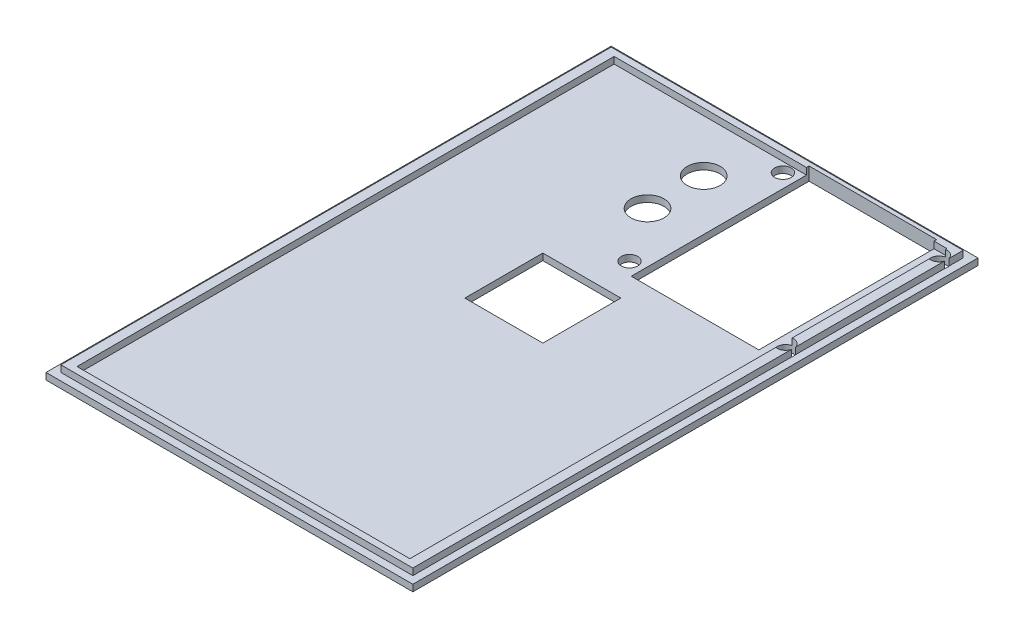
ISO-10303-21;
HEADER;
FILE_DESCRIPTION(('STEP AP214'),'2;1');
FILE_NAME('part.step','',(''),(''),'','','');
FILE_SCHEMA(('AUTOMOTIVE_DESIGN { 1 0 10303 214 1 1 1 1 }'));
ENDSEC;
DATA;
#1=APPLICATION_CONTEXT('core data for automotive mechanical design processes');
#2=APPLICATION_PROTOCOL_DEFINITION('international standard','automotive_design',2000,#1);
#3=PRODUCT_CONTEXT('',#1,'mechanical');
#4=PRODUCT('Part','Part','',(#3));
#5=PRODUCT_RELATED_PRODUCT_CATEGORY('part','',(#4));
#6=PRODUCT_DEFINITION_FORMATION('','',#4);
#7=PRODUCT_DEFINITION_CONTEXT('part definition',#1,'design');
#8=PRODUCT_DEFINITION('design','',#6,#7);
#9=PRODUCT_DEFINITION_SHAPE('','',#8);
#10=(LENGTH_UNIT() NAMED_UNIT(*) SI_UNIT(.MILLI.,.METRE.));
#11=(NAMED_UNIT(*) PLANE_ANGLE_UNIT() SI_UNIT($,.RADIAN.));
#12=(NAMED_UNIT(*) SI_UNIT($,.STERADIAN.) SOLID_ANGLE_UNIT());
#13=UNCERTAINTY_MEASURE_WITH_UNIT(LENGTH_MEASURE(1.E-05),#10,'distance_accuracy_value','');
#14=(GEOMETRIC_REPRESENTATION_CONTEXT(3) GLOBAL_UNCERTAINTY_ASSIGNED_CONTEXT((#13)) GLOBAL_UNIT_ASSIGNED_CONTEXT((#10,
#11,#12)) REPRESENTATION_CONTEXT('',''));
#15=CARTESIAN_POINT('',(0.,0.,0.));
#16=DIRECTION('',(0.,0.,1.));
#17=DIRECTION('',(1.,0.,0.));
#18=AXIS2_PLACEMENT_3D('',#15,#16,#17);
#19=CARTESIAN_POINT('',(0.,2.,0.));
#20=DIRECTION('',(0.,-1.,0.));
#21=DIRECTION('',(0.,0.,-1.));
#22=AXIS2_PLACEMENT_3D('',#19,#20,#21);
#23=PLANE('',#22);
#24=DIRECTION('',(0.,0.,-1.));
#25=VECTOR('',#24,1.);
#26=CARTESIAN_POINT('',(26.625,2.,41.625));
#27=LINE('',#26,#25);
#28=CARTESIAN_POINT('',(26.625,2.,41.625));
#29=VERTEX_POINT('',#28);
#30=CARTESIAN_POINT('',(26.625,2.,-15.638917400209));
#31=VERTEX_POINT('',#30);
#32=EDGE_CURVE('E440',#29,#31,#27,.T.);
#33=ORIENTED_EDGE('',*,*,#32,.T.);
#34=CARTESIAN_POINT('',(25.4190043572082,2.,-15.9631423339737));
#35=DIRECTION('',(0.,-1.,0.));
#36=DIRECTION('',(0.,0.,-1.));
#37=AXIS2_PLACEMENT_3D('',#34,#35,#36);
#38=CIRCLE('',#37,1.24881836073447);
#39=CARTESIAN_POINT('',(25.1779275998991,2.,-14.7378140941975));
#40=VERTEX_POINT('',#39);
#41=EDGE_CURVE('E375',#31,#40,#38,.T.);
#42=ORIENTED_EDGE('',*,*,#41,.T.);
#43=DIRECTION('',(0.,0.,-1.));
#44=VECTOR('',#43,1.);
#45=CARTESIAN_POINT('',(25.1779275998991,2.,40.6300599660008));
#46=LINE('',#45,#44);
#47=CARTESIAN_POINT('',(25.1779275998991,2.,40.6300599660008));
#48=VERTEX_POINT('',#47);
#49=EDGE_CURVE('E389',#48,#40,#46,.T.);
#50=ORIENTED_EDGE('',*,*,#49,.F.);
#51=DIRECTION('',(1.,0.,0.));
#52=VECTOR('',#51,1.);
#53=CARTESIAN_POINT('',(-25.1779275998991,2.,40.6300599660008));
#54=LINE('',#53,#52);
#55=CARTESIAN_POINT('',(-25.1779275998991,2.,40.6300599660008));
#56=VERTEX_POINT('',#55);
#57=EDGE_CURVE('E404',#56,#48,#54,.T.);
#58=ORIENTED_EDGE('',*,*,#57,.F.);
#59=DIRECTION('',(0.,0.,1.));
#60=VECTOR('',#59,1.);
#61=CARTESIAN_POINT('',(-25.1779275998991,2.,40.6300599660008));
#62=LINE('',#61,#60);
#63=CARTESIAN_POINT('',(-25.1779275998991,2.,-40.6300599660008));
#64=VERTEX_POINT('',#63);
#65=EDGE_CURVE('E400',#64,#56,#62,.T.);
#66=ORIENTED_EDGE('',*,*,#65,.F.);
#67=DIRECTION('',(-1.,0.,0.));
#68=VECTOR('',#67,1.);
#69=CARTESIAN_POINT('',(-25.1779275998991,2.,-40.6300599660008));
#70=LINE('',#69,#68);
#71=CARTESIAN_POINT('',(3.91900436854623,2.,-40.6300599660008));
#72=VERTEX_POINT('',#71);
#73=EDGE_CURVE('E393',#72,#64,#70,.T.);
#74=ORIENTED_EDGE('',*,*,#73,.F.);
#75=DIRECTION('',(0.,0.,-1.));
#76=VECTOR('',#75,1.);
#77=CARTESIAN_POINT('',(3.91900436854623,2.,0.));
#78=LINE('',#77,#76);
#79=CARTESIAN_POINT('',(3.91900436854623,2.,-41.0246657109832));
#80=VERTEX_POINT('',#79);
#81=EDGE_CURVE('E352',#72,#80,#78,.T.);
#82=ORIENTED_EDGE('',*,*,#81,.T.);
#83=DIRECTION('',(1.,0.,0.));
#84=VECTOR('',#83,1.);
#85=CARTESIAN_POINT('',(0.,2.,-41.0246657109832));
#86=LINE('',#85,#84);
#87=CARTESIAN_POINT('',(23.2190043685462,2.,-41.0246657109832));
#88=VERTEX_POINT('',#87);
#89=EDGE_CURVE('E11',#80,#88,#86,.T.);
#90=ORIENTED_EDGE('',*,*,#89,.T.);
#91=DIRECTION('',(0.,0.,1.));
#92=VECTOR('',#91,1.);
#93=CARTESIAN_POINT('',(23.2190043685462,2.,0.));
#94=LINE('',#93,#92);
#95=CARTESIAN_POINT('',(23.2190043685462,2.,-40.6300599660008));
#96=VERTEX_POINT('',#95);
#97=EDGE_CURVE('E360',#88,#96,#94,.T.);
#98=ORIENTED_EDGE('',*,*,#97,.T.);
#99=CARTESIAN_POINT('',(25.1779275998991,2.,-40.6300599660008));
#100=VERTEX_POINT('',#99);
#101=EDGE_CURVE('E396',#100,#96,#70,.T.);
#102=ORIENTED_EDGE('',*,*,#101,.F.);
#103=CARTESIAN_POINT('',(25.1779275998991,2.,-40.3910111293174));
#104=VERTEX_POINT('',#103);
#105=EDGE_CURVE('E395',#104,#100,#46,.T.);
#106=ORIENTED_EDGE('',*,*,#105,.F.);
#107=CARTESIAN_POINT('',(25.4190043572082,2.,-39.1624107865857));
#108=DIRECTION('',(0.,-1.,0.));
#109=DIRECTION('',(0.,0.,-1.));
#110=AXIS2_PLACEMENT_3D('',#107,#108,#109);
#111=CIRCLE('',#110,1.25202907517172);
#112=CARTESIAN_POINT('',(26.625,2.,-39.4987905045273));
#113=VERTEX_POINT('',#112);
#114=EDGE_CURVE('E331',#104,#113,#111,.T.);
#115=ORIENTED_EDGE('',*,*,#114,.T.);
#116=CARTESIAN_POINT('',(26.625,2.,-41.625));
#117=VERTEX_POINT('',#116);
#118=EDGE_CURVE('E446',#113,#117,#27,.T.);
#119=ORIENTED_EDGE('',*,*,#118,.T.);
#120=DIRECTION('',(-1.,0.,0.));
#121=VECTOR('',#120,1.);
#122=CARTESIAN_POINT('',(-26.625,2.,-41.625));
#123=LINE('',#122,#121);
#124=CARTESIAN_POINT('',(-26.625,2.,-41.625));
#125=VERTEX_POINT('',#124);
#126=EDGE_CURVE('E444',#117,#125,#123,.T.);
#127=ORIENTED_EDGE('',*,*,#126,.T.);
#128=DIRECTION('',(0.,0.,1.));
#129=VECTOR('',#128,1.);
#130=CARTESIAN_POINT('',(-26.625,2.,41.625));
#131=LINE('',#130,#129);
#132=CARTESIAN_POINT('',(-26.625,2.,41.625));
#133=VERTEX_POINT('',#132);
#134=EDGE_CURVE('E449',#125,#133,#131,.T.);
#135=ORIENTED_EDGE('',*,*,#134,.T.);
#136=DIRECTION('',(1.,0.,0.));
#137=VECTOR('',#136,1.);
#138=CARTESIAN_POINT('',(-26.625,2.,41.625));
#139=LINE('',#138,#137);
#140=EDGE_CURVE('E452',#133,#29,#139,.T.);
#141=ORIENTED_EDGE('',*,*,#140,.T.);
#142=EDGE_LOOP('',(#33,#42,#50,#58,#66,#74,#82,#90,#98,#102,#106,#115,#119,#127,#135,#141));
#143=FACE_BOUND('',#142,.T.);
#144=ADVANCED_FACE('F39',(#143),#23,.F.);
#145=CARTESIAN_POINT('',(26.625,2.,41.625));
#146=DIRECTION('',(-1.,0.,0.));
#147=DIRECTION('',(0.,0.,1.));
#148=AXIS2_PLACEMENT_3D('',#145,#146,#147);
#149=PLANE('',#148);
#150=CARTESIAN_POINT('',(26.625,2.,-16.2873672677383));
#151=VERTEX_POINT('',#150);
#152=CARTESIAN_POINT('',(26.625,2.,-38.826031068644));
#153=VERTEX_POINT('',#152);
#154=EDGE_CURVE('E445',#151,#153,#27,.T.);
#155=ORIENTED_EDGE('',*,*,#154,.F.);
#156=DIRECTION('',(0.,-1.,0.));
#157=VECTOR('',#156,1.);
#158=CARTESIAN_POINT('',(26.625,3.,-16.2873672677383));
#159=LINE('',#158,#157);
#160=CARTESIAN_POINT('',(26.625,1.,-16.2873672677383));
#161=VERTEX_POINT('',#160);
#162=EDGE_CURVE('E380',#151,#161,#159,.T.);
#163=ORIENTED_EDGE('',*,*,#162,.T.);
#164=DIRECTION('',(0.,0.,-1.));
#165=VECTOR('',#164,1.);
#166=CARTESIAN_POINT('',(26.625,1.,41.625));
#167=LINE('',#166,#165);
#168=CARTESIAN_POINT('',(26.625,1.,-38.826031068644));
#169=VERTEX_POINT('',#168);
#170=EDGE_CURVE('E461',#161,#169,#167,.T.);
#171=ORIENTED_EDGE('',*,*,#170,.T.);
#172=DIRECTION('',(0.,-1.,0.));
#173=VECTOR('',#172,1.);
#174=CARTESIAN_POINT('',(26.625,3.,-38.826031068644));
#175=LINE('',#174,#173);
#176=EDGE_CURVE('E336',#169,#153,#175,.F.);
#177=ORIENTED_EDGE('',*,*,#176,.T.);
#178=EDGE_LOOP('',(#155,#163,#171,#177));
#179=FACE_BOUND('',#178,.T.);
#180=ADVANCED_FACE('F635',(#179),#149,.F.);
#181=ORIENTED_EDGE('',*,*,#118,.F.);
#182=DIRECTION('',(0.,-1.,0.));
#183=VECTOR('',#182,1.);
#184=CARTESIAN_POINT('',(26.625,3.,-39.4987905045273));
#185=LINE('',#184,#183);
#186=CARTESIAN_POINT('',(26.625,1.,-39.4987905045273));
#187=VERTEX_POINT('',#186);
#188=EDGE_CURVE('E340',#113,#187,#185,.T.);
#189=ORIENTED_EDGE('',*,*,#188,.T.);
#190=CARTESIAN_POINT('',(26.625,1.,-41.625));
#191=VERTEX_POINT('',#190);
#192=EDGE_CURVE('E439',#187,#191,#167,.T.);
#193=ORIENTED_EDGE('',*,*,#192,.T.);
#194=DIRECTION('',(0.,-1.,0.));
#195=VECTOR('',#194,1.);
#196=CARTESIAN_POINT('',(26.625,2.,-41.625));
#197=LINE('',#196,#195);
#198=EDGE_CURVE('E484',#117,#191,#197,.T.);
#199=ORIENTED_EDGE('',*,*,#198,.F.);
#200=EDGE_LOOP('',(#181,#189,#193,#199));
#201=FACE_BOUND('',#200,.T.);
#202=ADVANCED_FACE('F639',(#201),#149,.F.);
#203=CARTESIAN_POINT('',(25.1779275998991,2.,40.6300599660008));
#204=DIRECTION('',(-1.,0.,0.));
#205=DIRECTION('',(0.,0.,1.));
#206=AXIS2_PLACEMENT_3D('',#203,#204,#205);
#207=PLANE('',#206);
#208=DIRECTION('',(0.,-1.,0.));
#209=VECTOR('',#208,1.);
#210=CARTESIAN_POINT('',(25.1779275998991,3.,-17.1884705737498));
#211=LINE('',#210,#209);
#212=CARTESIAN_POINT('',(25.1779275998991,2.,-17.1884705737498));
#213=VERTEX_POINT('',#212);
#214=CARTESIAN_POINT('',(25.1779275998991,1.,-17.1884705737498));
#215=VERTEX_POINT('',#214);
#216=EDGE_CURVE('E368',#213,#215,#211,.T.);
#217=ORIENTED_EDGE('',*,*,#216,.F.);
#218=CARTESIAN_POINT('',(25.1779275998991,2.,-37.9338104438539));
#219=VERTEX_POINT('',#218);
#220=EDGE_CURVE('E394',#213,#219,#46,.T.);
#221=ORIENTED_EDGE('',*,*,#220,.T.);
#222=DIRECTION('',(0.,-1.,0.));
#223=VECTOR('',#222,1.);
#224=CARTESIAN_POINT('',(25.1779275998991,3.,-37.9338104438539));
#225=LINE('',#224,#223);
#226=CARTESIAN_POINT('',(25.1779275998991,1.,-37.9338104438539));
#227=VERTEX_POINT('',#226);
#228=EDGE_CURVE('E325',#227,#219,#225,.F.);
#229=ORIENTED_EDGE('',*,*,#228,.F.);
#230=DIRECTION('',(0.,0.,-1.));
#231=VECTOR('',#230,1.);
#232=CARTESIAN_POINT('',(25.1779275998991,1.,40.6300599660008));
#233=LINE('',#232,#231);
#234=EDGE_CURVE('E413',#215,#227,#233,.T.);
#235=ORIENTED_EDGE('',*,*,#234,.F.);
#236=EDGE_LOOP('',(#217,#221,#229,#235));
#237=FACE_BOUND('',#236,.T.);
#238=ADVANCED_FACE('F583',(#237),#207,.T.);
#239=DIRECTION('',(0.,-1.,0.));
#240=VECTOR('',#239,1.);
#241=CARTESIAN_POINT('',(25.1779275998991,3.,-40.3910111293174));
#242=LINE('',#241,#240);
#243=CARTESIAN_POINT('',(25.1779275998991,1.,-40.3910111293174));
#244=VERTEX_POINT('',#243);
#245=EDGE_CURVE('E328',#104,#244,#242,.T.);
#246=ORIENTED_EDGE('',*,*,#245,.F.);
#247=ORIENTED_EDGE('',*,*,#105,.T.);
#248=DIRECTION('',(0.,-1.,0.));
#249=VECTOR('',#248,1.);
#250=CARTESIAN_POINT('',(25.1779275998991,2.,-40.6300599660008));
#251=LINE('',#250,#249);
#252=CARTESIAN_POINT('',(25.1779275998991,1.,-40.6300599660008));
#253=VERTEX_POINT('',#252);
#254=EDGE_CURVE('E435',#100,#253,#251,.T.);
#255=ORIENTED_EDGE('',*,*,#254,.T.);
#256=EDGE_CURVE('E388',#244,#253,#233,.T.);
#257=ORIENTED_EDGE('',*,*,#256,.F.);
#258=EDGE_LOOP('',(#246,#247,#255,#257));
#259=FACE_BOUND('',#258,.T.);
#260=ADVANCED_FACE('F597',(#259),#207,.T.);
#261=CARTESIAN_POINT('',(-25.1779275998991,2.,-40.6300599660008));
#262=DIRECTION('',(0.,0.,1.));
#263=DIRECTION('',(1.,0.,0.));
#264=AXIS2_PLACEMENT_3D('',#261,#262,#263);
#265=PLANE('',#264);
#266=DIRECTION('',(0.,1.,0.));
#267=VECTOR('',#266,1.);
#268=CARTESIAN_POINT('',(23.2190043685462,2.,-40.6300599660008));
#269=LINE('',#268,#267);
#270=CARTESIAN_POINT('',(23.2190043685462,1.,-40.6300599660008));
#271=VERTEX_POINT('',#270);
#272=EDGE_CURVE('E357',#271,#96,#269,.T.);
#273=ORIENTED_EDGE('',*,*,#272,.F.);
#274=DIRECTION('',(-1.,0.,0.));
#275=VECTOR('',#274,1.);
#276=CARTESIAN_POINT('',(-25.1779275998991,1.,-40.6300599660008));
#277=LINE('',#276,#275);
#278=EDGE_CURVE('E414',#253,#271,#277,.T.);
#279=ORIENTED_EDGE('',*,*,#278,.F.);
#280=ORIENTED_EDGE('',*,*,#254,.F.);
#281=ORIENTED_EDGE('',*,*,#101,.T.);
#282=EDGE_LOOP('',(#273,#279,#280,#281));
#283=FACE_BOUND('',#282,.T.);
#284=ADVANCED_FACE('F595',(#283),#265,.T.);
#285=CARTESIAN_POINT('',(0.,1.,0.));
#286=DIRECTION('',(0.,-1.,0.));
#287=DIRECTION('',(0.,0.,-1.));
#288=AXIS2_PLACEMENT_3D('',#285,#286,#287);
#289=PLANE('',#288);
#290=DIRECTION('',(0.,0.,-1.));
#291=VECTOR('',#290,1.);
#292=CARTESIAN_POINT('',(27.75,1.,42.75));
#293=LINE('',#292,#291);
#294=CARTESIAN_POINT('',(27.75,1.,42.75));
#295=VERTEX_POINT('',#294);
#296=CARTESIAN_POINT('',(27.75,1.,-42.75));
#297=VERTEX_POINT('',#296);
#298=EDGE_CURVE('E489',#295,#297,#293,.T.);
#299=ORIENTED_EDGE('',*,*,#298,.T.);
#300=DIRECTION('',(-1.,0.,0.));
#301=VECTOR('',#300,1.);
#302=CARTESIAN_POINT('',(-27.75,1.,-42.75));
#303=LINE('',#302,#301);
#304=CARTESIAN_POINT('',(-27.75,1.,-42.75));
#305=VERTEX_POINT('',#304);
#306=EDGE_CURVE('E493',#297,#305,#303,.T.);
#307=ORIENTED_EDGE('',*,*,#306,.T.);
#308=DIRECTION('',(0.,0.,1.));
#309=VECTOR('',#308,1.);
#310=CARTESIAN_POINT('',(-27.75,1.,42.75));
#311=LINE('',#310,#309);
#312=CARTESIAN_POINT('',(-27.75,1.,42.75));
#313=VERTEX_POINT('',#312);
#314=EDGE_CURVE('E497',#305,#313,#311,.T.);
#315=ORIENTED_EDGE('',*,*,#314,.T.);
#316=DIRECTION('',(1.,0.,0.));
#317=VECTOR('',#316,1.);
#318=CARTESIAN_POINT('',(-27.75,1.,42.75));
#319=LINE('',#318,#317);
#320=EDGE_CURVE('E500',#313,#295,#319,.T.);
#321=ORIENTED_EDGE('',*,*,#320,.T.);
#322=EDGE_LOOP('',(#299,#307,#315,#321));
#323=FACE_BOUND('',#322,.T.);
#324=ORIENTED_EDGE('',*,*,#170,.F.);
#325=CARTESIAN_POINT('',(25.4190043572082,1.,-15.9631423339737));
#326=DIRECTION('',(0.,-1.,0.));
#327=DIRECTION('',(0.,0.,-1.));
#328=AXIS2_PLACEMENT_3D('',#325,#326,#327);
#329=CIRCLE('',#328,1.24881836073447);
#330=CARTESIAN_POINT('',(26.625,1.,-15.638917400209));
#331=VERTEX_POINT('',#330);
#332=EDGE_CURVE('E384',#161,#331,#329,.T.);
#333=ORIENTED_EDGE('',*,*,#332,.T.);
#334=CARTESIAN_POINT('',(26.625,1.,41.625));
#335=VERTEX_POINT('',#334);
#336=EDGE_CURVE('E456',#335,#331,#167,.T.);
#337=ORIENTED_EDGE('',*,*,#336,.F.);
#338=DIRECTION('',(1.,0.,0.));
#339=VECTOR('',#338,1.);
#340=CARTESIAN_POINT('',(-26.625,1.,41.625));
#341=LINE('',#340,#339);
#342=CARTESIAN_POINT('',(-26.625,1.,41.625));
#343=VERTEX_POINT('',#342);
#344=EDGE_CURVE('E469',#343,#335,#341,.T.);
#345=ORIENTED_EDGE('',*,*,#344,.F.);
#346=DIRECTION('',(0.,0.,1.));
#347=VECTOR('',#346,1.);
#348=CARTESIAN_POINT('',(-26.625,1.,41.625));
#349=LINE('',#348,#347);
#350=CARTESIAN_POINT('',(-26.625,1.,-41.625));
#351=VERTEX_POINT('',#350);
#352=EDGE_CURVE('E465',#351,#343,#349,.T.);
#353=ORIENTED_EDGE('',*,*,#352,.F.);
#354=DIRECTION('',(-1.,0.,0.));
#355=VECTOR('',#354,1.);
#356=CARTESIAN_POINT('',(-26.625,1.,-41.625));
#357=LINE('',#356,#355);
#358=EDGE_CURVE('E460',#191,#351,#357,.T.);
#359=ORIENTED_EDGE('',*,*,#358,.F.);
#360=ORIENTED_EDGE('',*,*,#192,.F.);
#361=CARTESIAN_POINT('',(25.4190043572082,1.,-39.1624107865857));
#362=DIRECTION('',(0.,-1.,0.));
#363=DIRECTION('',(0.,0.,-1.));
#364=AXIS2_PLACEMENT_3D('',#361,#362,#363);
#365=CIRCLE('',#364,1.25202907517172);
#366=EDGE_CURVE('E344',#187,#169,#365,.T.);
#367=ORIENTED_EDGE('',*,*,#366,.T.);
#368=EDGE_LOOP('',(#324,#333,#337,#345,#353,#359,#360,#367));
#369=FACE_BOUND('',#368,.T.);
#370=ADVANCED_FACE('F663',(#323,#369),#289,.F.);
#371=CARTESIAN_POINT('',(27.75,1.,42.75));
#372=DIRECTION('',(-1.,0.,0.));
#373=DIRECTION('',(0.,0.,1.));
#374=AXIS2_PLACEMENT_3D('',#371,#372,#373);
#375=PLANE('',#374);
#376=DIRECTION('',(0.,0.,-1.));
#377=VECTOR('',#376,1.);
#378=CARTESIAN_POINT('',(27.75,0.,42.75));
#379=LINE('',#378,#377);
#380=CARTESIAN_POINT('',(27.75,0.,42.75));
#381=VERTEX_POINT('',#380);
#382=CARTESIAN_POINT('',(27.75,0.,-42.75));
#383=VERTEX_POINT('',#382);
#384=EDGE_CURVE('E488',#381,#383,#379,.T.);
#385=ORIENTED_EDGE('',*,*,#384,.T.);
#386=DIRECTION('',(0.,-1.,0.));
#387=VECTOR('',#386,1.);
#388=CARTESIAN_POINT('',(27.75,1.,-42.75));
#389=LINE('',#388,#387);
#390=EDGE_CURVE('E526',#297,#383,#389,.T.);
#391=ORIENTED_EDGE('',*,*,#390,.F.);
#392=ORIENTED_EDGE('',*,*,#298,.F.);
#393=DIRECTION('',(0.,-1.,0.));
#394=VECTOR('',#393,1.);
#395=CARTESIAN_POINT('',(27.75,1.,42.75));
#396=LINE('',#395,#394);
#397=EDGE_CURVE('E503',#295,#381,#396,.T.);
#398=ORIENTED_EDGE('',*,*,#397,.T.);
#399=EDGE_LOOP('',(#385,#391,#392,#398));
#400=FACE_BOUND('',#399,.T.);
#401=ADVANCED_FACE('F41',(#400),#375,.F.);
#402=CARTESIAN_POINT('',(-27.75,1.,-42.75));
#403=DIRECTION('',(0.,0.,1.));
#404=DIRECTION('',(1.,0.,0.));
#405=AXIS2_PLACEMENT_3D('',#402,#403,#404);
#406=PLANE('',#405);
#407=DIRECTION('',(-1.,0.,0.));
#408=VECTOR('',#407,1.);
#409=CARTESIAN_POINT('',(-27.75,0.,-42.75));
#410=LINE('',#409,#408);
#411=CARTESIAN_POINT('',(-27.75,0.,-42.75));
#412=VERTEX_POINT('',#411);
#413=EDGE_CURVE('E507',#383,#412,#410,.T.);
#414=ORIENTED_EDGE('',*,*,#413,.T.);
#415=DIRECTION('',(0.,-1.,0.));
#416=VECTOR('',#415,1.);
#417=CARTESIAN_POINT('',(-27.75,1.,-42.75));
#418=LINE('',#417,#416);
#419=EDGE_CURVE('E522',#305,#412,#418,.T.);
#420=ORIENTED_EDGE('',*,*,#419,.F.);
#421=ORIENTED_EDGE('',*,*,#306,.F.);
#422=ORIENTED_EDGE('',*,*,#390,.T.);
#423=EDGE_LOOP('',(#414,#420,#421,#422));
#424=FACE_BOUND('',#423,.T.);
#425=ADVANCED_FACE('F680',(#424),#406,.F.);
#426=CARTESIAN_POINT('',(-27.75,1.,42.75));
#427=DIRECTION('',(1.,0.,0.));
#428=DIRECTION('',(0.,0.,-1.));
#429=AXIS2_PLACEMENT_3D('',#426,#427,#428);
#430=PLANE('',#429);
#431=DIRECTION('',(0.,0.,1.));
#432=VECTOR('',#431,1.);
#433=CARTESIAN_POINT('',(-27.75,0.,42.75));
#434=LINE('',#433,#432);
#435=CARTESIAN_POINT('',(-27.75,0.,42.75));
#436=VERTEX_POINT('',#435);
#437=EDGE_CURVE('E510',#412,#436,#434,.T.);
#438=ORIENTED_EDGE('',*,*,#437,.T.);
#439=DIRECTION('',(0.,-1.,0.));
#440=VECTOR('',#439,1.);
#441=CARTESIAN_POINT('',(-27.75,1.,42.75));
#442=LINE('',#441,#440);
#443=EDGE_CURVE('E518',#313,#436,#442,.T.);
#444=ORIENTED_EDGE('',*,*,#443,.F.);
#445=ORIENTED_EDGE('',*,*,#314,.F.);
#446=ORIENTED_EDGE('',*,*,#419,.T.);
#447=EDGE_LOOP('',(#438,#444,#445,#446));
#448=FACE_BOUND('',#447,.T.);
#449=ADVANCED_FACE('F628',(#448),#430,.F.);
#450=CARTESIAN_POINT('',(-27.75,1.,42.75));
#451=DIRECTION('',(0.,0.,-1.));
#452=DIRECTION('',(-1.,0.,0.));
#453=AXIS2_PLACEMENT_3D('',#450,#451,#452);
#454=PLANE('',#453);
#455=DIRECTION('',(1.,0.,0.));
#456=VECTOR('',#455,1.);
#457=CARTESIAN_POINT('',(-27.75,0.,42.75));
#458=LINE('',#457,#456);
#459=EDGE_CURVE('E494',#436,#381,#458,.T.);
#460=ORIENTED_EDGE('',*,*,#459,.T.);
#461=ORIENTED_EDGE('',*,*,#397,.F.);
#462=ORIENTED_EDGE('',*,*,#320,.F.);
#463=ORIENTED_EDGE('',*,*,#443,.T.);
#464=EDGE_LOOP('',(#460,#461,#462,#463));
#465=FACE_BOUND('',#464,.T.);
#466=ADVANCED_FACE('F619',(#465),#454,.F.);
#467=CARTESIAN_POINT('',(0.,0.,0.));
#468=DIRECTION('',(0.,-1.,0.));
#469=DIRECTION('',(0.,0.,-1.));
#470=AXIS2_PLACEMENT_3D('',#467,#468,#469);
#471=PLANE('',#470);
#472=CARTESIAN_POINT('',(25.4190043572082,0.,-15.9631423339737));
#473=DIRECTION('',(0.,-1.,0.));
#474=DIRECTION('',(0.,0.,-1.));
#475=AXIS2_PLACEMENT_3D('',#472,#473,#474);
#476=CIRCLE('',#475,1.24881836073447);
#477=CARTESIAN_POINT('',(25.4190043572082,0.,-17.2119606947081));
#478=VERTEX_POINT('',#477);
#479=EDGE_CURVE('E286',#478,#478,#476,.T.);
#480=ORIENTED_EDGE('',*,*,#479,.F.);
#481=EDGE_LOOP('',(#480));
#482=FACE_BOUND('',#481,.T.);
#483=CARTESIAN_POINT('',(1.81900436854623,0.,-15.9624107903293));
#484=DIRECTION('',(0.,-1.,0.));
#485=DIRECTION('',(0.,0.,-1.));
#486=AXIS2_PLACEMENT_3D('',#483,#484,#485);
#487=CIRCLE('',#486,1.25);
#488=CARTESIAN_POINT('',(1.81900436854623,0.,-17.2124107903293));
#489=VERTEX_POINT('',#488);
#490=EDGE_CURVE('E282',#489,#489,#487,.T.);
#491=ORIENTED_EDGE('',*,*,#490,.F.);
#492=EDGE_LOOP('',(#491));
#493=FACE_BOUND('',#492,.T.);
#494=DIRECTION('',(0.,0.,1.));
#495=VECTOR('',#494,1.);
#496=CARTESIAN_POINT('',(23.2190043685462,0.,-41.0246657109832));
#497=LINE('',#496,#495);
#498=CARTESIAN_POINT('',(23.2190043685462,0.,-41.0246657109832));
#499=VERTEX_POINT('',#498);
#500=CARTESIAN_POINT('',(23.2190043685462,0.,-14.1246657109832));
#501=VERTEX_POINT('',#500);
#502=EDGE_CURVE('E55',#499,#501,#497,.T.);
#503=ORIENTED_EDGE('',*,*,#502,.F.);
#504=DIRECTION('',(1.,0.,0.));
#505=VECTOR('',#504,1.);
#506=CARTESIAN_POINT('',(3.91900436854623,0.,-41.0246657109832));
#507=LINE('',#506,#505);
#508=CARTESIAN_POINT('',(3.91900436854623,0.,-41.0246657109832));
#509=VERTEX_POINT('',#508);
#510=EDGE_CURVE('E306',#509,#499,#507,.T.);
#511=ORIENTED_EDGE('',*,*,#510,.F.);
#512=DIRECTION('',(0.,0.,-1.));
#513=VECTOR('',#512,1.);
#514=CARTESIAN_POINT('',(3.91900436854623,0.,-41.0246657109832));
#515=LINE('',#514,#513);
#516=CARTESIAN_POINT('',(3.91900436854623,0.,-14.1246657109832));
#517=VERTEX_POINT('',#516);
#518=EDGE_CURVE('E302',#517,#509,#515,.T.);
#519=ORIENTED_EDGE('',*,*,#518,.F.);
#520=DIRECTION('',(-1.,0.,0.));
#521=VECTOR('',#520,1.);
#522=CARTESIAN_POINT('',(3.91900436854623,0.,-14.1246657109832));
#523=LINE('',#522,#521);
#524=EDGE_CURVE('E298',#501,#517,#523,.T.);
#525=ORIENTED_EDGE('',*,*,#524,.F.);
#526=EDGE_LOOP('',(#503,#511,#519,#525));
#527=FACE_BOUND('',#526,.T.);
#528=CARTESIAN_POINT('',(-3.74999999999998,0.,-24.25));
#529=DIRECTION('',(0.,-1.,0.));
#530=DIRECTION('',(0.,0.,-1.));
#531=AXIS2_PLACEMENT_3D('',#528,#529,#530);
#532=CIRCLE('',#531,2.5);
#533=CARTESIAN_POINT('',(-3.74999999999998,0.,-26.75));
#534=VERTEX_POINT('',#533);
#535=EDGE_CURVE('E290',#534,#534,#532,.T.);
#536=ORIENTED_EDGE('',*,*,#535,.F.);
#537=EDGE_LOOP('',(#536));
#538=FACE_BOUND('',#537,.T.);
#539=CARTESIAN_POINT('',(1.81858759112485,0.,-39.1624107865857));
#540=DIRECTION('',(0.,-1.,0.));
#541=DIRECTION('',(0.,0.,-1.));
#542=AXIS2_PLACEMENT_3D('',#539,#540,#541);
#543=CIRCLE('',#542,1.25);
#544=CARTESIAN_POINT('',(1.81858759112485,0.,-40.4124107865857));
#545=VERTEX_POINT('',#544);
#546=EDGE_CURVE('E273',#545,#545,#543,.T.);
#547=ORIENTED_EDGE('',*,*,#546,.F.);
#548=EDGE_LOOP('',(#547));
#549=FACE_BOUND('',#548,.T.);
#550=DIRECTION('',(0.,0.,-1.));
#551=VECTOR('',#550,1.);
#552=CARTESIAN_POINT('',(-5.80865253379093,0.,1.32421178758027));
#553=LINE('',#552,#551);
#554=CARTESIAN_POINT('',(-5.80865253379093,0.,1.32421178758027));
#555=VERTEX_POINT('',#554);
#556=CARTESIAN_POINT('',(-5.80865253379093,0.,-10.4757882124197));
#557=VERTEX_POINT('',#556);
#558=EDGE_CURVE('E63',#555,#557,#553,.T.);
#559=ORIENTED_EDGE('',*,*,#558,.F.);
#560=DIRECTION('',(-1.,0.,0.));
#561=VECTOR('',#560,1.);
#562=CARTESIAN_POINT('',(5.99134746620908,0.,1.32421178758027));
#563=LINE('',#562,#561);
#564=CARTESIAN_POINT('',(5.99134746620908,0.,1.32421178758027));
#565=VERTEX_POINT('',#564);
#566=EDGE_CURVE('E263',#565,#555,#563,.T.);
#567=ORIENTED_EDGE('',*,*,#566,.F.);
#568=DIRECTION('',(0.,0.,1.));
#569=VECTOR('',#568,1.);
#570=CARTESIAN_POINT('',(5.99134746620908,0.,1.32421178758027));
#571=LINE('',#570,#569);
#572=CARTESIAN_POINT('',(5.99134746620908,0.,-10.4757882124197));
#573=VERTEX_POINT('',#572);
#574=EDGE_CURVE('E244',#573,#565,#571,.T.);
#575=ORIENTED_EDGE('',*,*,#574,.F.);
#576=DIRECTION('',(1.,0.,0.));
#577=VECTOR('',#576,1.);
#578=CARTESIAN_POINT('',(5.99134746620908,0.,-10.4757882124197));
#579=LINE('',#578,#577);
#580=EDGE_CURVE('E255',#557,#573,#579,.T.);
#581=ORIENTED_EDGE('',*,*,#580,.F.);
#582=EDGE_LOOP('',(#559,#567,#575,#581));
#583=FACE_BOUND('',#582,.T.);
#584=CARTESIAN_POINT('',(25.4190043572082,0.,-39.1624107865857));
#585=DIRECTION('',(0.,-1.,0.));
#586=DIRECTION('',(0.,0.,-1.));
#587=AXIS2_PLACEMENT_3D('',#584,#585,#586);
#588=CIRCLE('',#587,1.25202907517172);
#589=CARTESIAN_POINT('',(25.4190043572082,0.,-40.4144398617574));
#590=VERTEX_POINT('',#589);
#591=EDGE_CURVE('E278',#590,#590,#588,.T.);
#592=ORIENTED_EDGE('',*,*,#591,.F.);
#593=EDGE_LOOP('',(#592));
#594=FACE_BOUND('',#593,.T.);
#595=CARTESIAN_POINT('',(-3.74999999999998,0.,-32.75));
#596=DIRECTION('',(0.,-1.,0.));
#597=DIRECTION('',(0.,0.,-1.));
#598=AXIS2_PLACEMENT_3D('',#595,#596,#597);
#599=CIRCLE('',#598,2.5);
#600=CARTESIAN_POINT('',(-3.74999999999998,0.,-35.25));
#601=VERTEX_POINT('',#600);
#602=EDGE_CURVE('E294',#601,#601,#599,.T.);
#603=ORIENTED_EDGE('',*,*,#602,.F.);
#604=EDGE_LOOP('',(#603));
#605=FACE_BOUND('',#604,.T.);
#606=ORIENTED_EDGE('',*,*,#384,.F.);
#607=ORIENTED_EDGE('',*,*,#459,.F.);
#608=ORIENTED_EDGE('',*,*,#437,.F.);
#609=ORIENTED_EDGE('',*,*,#413,.F.);
#610=EDGE_LOOP('',(#606,#607,#608,#609));
#611=FACE_BOUND('',#610,.T.);
#612=ADVANCED_FACE('F260',(#482,#493,#527,#538,#549,#583,#594,#605,#611),#471,.T.);
#613=ORIENTED_EDGE('',*,*,#220,.F.);
#614=EDGE_CURVE('E371',#213,#151,#38,.T.);
#615=ORIENTED_EDGE('',*,*,#614,.T.);
#616=ORIENTED_EDGE('',*,*,#154,.T.);
#617=EDGE_CURVE('E335',#153,#219,#111,.T.);
#618=ORIENTED_EDGE('',*,*,#617,.T.);
#619=EDGE_LOOP('',(#613,#615,#616,#618));
#620=FACE_BOUND('',#619,.T.);
#621=ADVANCED_FACE('F604',(#620),#23,.F.);
#622=ORIENTED_EDGE('',*,*,#336,.T.);
#623=DIRECTION('',(0.,-1.,0.));
#624=VECTOR('',#623,1.);
#625=CARTESIAN_POINT('',(26.625,3.,-15.638917400209));
#626=LINE('',#625,#624);
#627=EDGE_CURVE('E376',#331,#31,#626,.F.);
#628=ORIENTED_EDGE('',*,*,#627,.T.);
#629=ORIENTED_EDGE('',*,*,#32,.F.);
#630=DIRECTION('',(0.,-1.,0.));
#631=VECTOR('',#630,1.);
#632=CARTESIAN_POINT('',(26.625,2.,41.625));
#633=LINE('',#632,#631);
#634=EDGE_CURVE('E455',#29,#335,#633,.T.);
#635=ORIENTED_EDGE('',*,*,#634,.T.);
#636=EDGE_LOOP('',(#622,#628,#629,#635));
#637=FACE_BOUND('',#636,.T.);
#638=ADVANCED_FACE('F626',(#637),#149,.F.);
#639=CARTESIAN_POINT('',(-26.625,2.,-41.625));
#640=DIRECTION('',(0.,0.,1.));
#641=DIRECTION('',(1.,0.,0.));
#642=AXIS2_PLACEMENT_3D('',#639,#640,#641);
#643=PLANE('',#642);
#644=ORIENTED_EDGE('',*,*,#358,.T.);
#645=DIRECTION('',(0.,-1.,0.));
#646=VECTOR('',#645,1.);
#647=CARTESIAN_POINT('',(-26.625,2.,-41.625));
#648=LINE('',#647,#646);
#649=EDGE_CURVE('E480',#125,#351,#648,.T.);
#650=ORIENTED_EDGE('',*,*,#649,.F.);
#651=ORIENTED_EDGE('',*,*,#126,.F.);
#652=ORIENTED_EDGE('',*,*,#198,.T.);
#653=EDGE_LOOP('',(#644,#650,#651,#652));
#654=FACE_BOUND('',#653,.T.);
#655=ADVANCED_FACE('F653',(#654),#643,.F.);
#656=CARTESIAN_POINT('',(-26.625,2.,41.625));
#657=DIRECTION('',(1.,0.,0.));
#658=DIRECTION('',(0.,0.,-1.));
#659=AXIS2_PLACEMENT_3D('',#656,#657,#658);
#660=PLANE('',#659);
#661=ORIENTED_EDGE('',*,*,#352,.T.);
#662=DIRECTION('',(0.,-1.,0.));
#663=VECTOR('',#662,1.);
#664=CARTESIAN_POINT('',(-26.625,2.,41.625));
#665=LINE('',#664,#663);
#666=EDGE_CURVE('E476',#133,#343,#665,.T.);
#667=ORIENTED_EDGE('',*,*,#666,.F.);
#668=ORIENTED_EDGE('',*,*,#134,.F.);
#669=ORIENTED_EDGE('',*,*,#649,.T.);
#670=EDGE_LOOP('',(#661,#667,#668,#669));
#671=FACE_BOUND('',#670,.T.);
#672=ADVANCED_FACE('F649',(#671),#660,.F.);
#673=CARTESIAN_POINT('',(-26.625,2.,41.625));
#674=DIRECTION('',(0.,0.,-1.));
#675=DIRECTION('',(-1.,0.,0.));
#676=AXIS2_PLACEMENT_3D('',#673,#674,#675);
#677=PLANE('',#676);
#678=ORIENTED_EDGE('',*,*,#344,.T.);
#679=ORIENTED_EDGE('',*,*,#634,.F.);
#680=ORIENTED_EDGE('',*,*,#140,.F.);
#681=ORIENTED_EDGE('',*,*,#666,.T.);
#682=EDGE_LOOP('',(#678,#679,#680,#681));
#683=FACE_BOUND('',#682,.T.);
#684=ADVANCED_FACE('F646',(#683),#677,.F.);
#685=DIRECTION('',(0.,-1.,0.));
#686=VECTOR('',#685,1.);
#687=CARTESIAN_POINT('',(25.1779275998991,3.,-14.7378140941975));
#688=LINE('',#687,#686);
#689=CARTESIAN_POINT('',(25.1779275998991,1.,-14.7378140941975));
#690=VERTEX_POINT('',#689);
#691=EDGE_CURVE('E365',#690,#40,#688,.F.);
#692=ORIENTED_EDGE('',*,*,#691,.F.);
#693=CARTESIAN_POINT('',(25.1779275998991,1.,40.6300599660008));
#694=VERTEX_POINT('',#693);
#695=EDGE_CURVE('E408',#694,#690,#233,.T.);
#696=ORIENTED_EDGE('',*,*,#695,.F.);
#697=DIRECTION('',(0.,-1.,0.));
#698=VECTOR('',#697,1.);
#699=CARTESIAN_POINT('',(25.1779275998991,2.,40.6300599660008));
#700=LINE('',#699,#698);
#701=EDGE_CURVE('E407',#48,#694,#700,.T.);
#702=ORIENTED_EDGE('',*,*,#701,.F.);
#703=ORIENTED_EDGE('',*,*,#49,.T.);
#704=EDGE_LOOP('',(#692,#696,#702,#703));
#705=FACE_BOUND('',#704,.T.);
#706=ADVANCED_FACE('F644',(#705),#207,.T.);
#707=DIRECTION('',(0.,-1.,0.));
#708=VECTOR('',#707,1.);
#709=CARTESIAN_POINT('',(3.91900436854623,2.,-40.6300599660008));
#710=LINE('',#709,#708);
#711=CARTESIAN_POINT('',(3.91900436854623,1.,-40.6300599660008));
#712=VERTEX_POINT('',#711);
#713=EDGE_CURVE('E349',#72,#712,#710,.T.);
#714=ORIENTED_EDGE('',*,*,#713,.F.);
#715=ORIENTED_EDGE('',*,*,#73,.T.);
#716=DIRECTION('',(0.,-1.,0.));
#717=VECTOR('',#716,1.);
#718=CARTESIAN_POINT('',(-25.1779275998991,2.,-40.6300599660008));
#719=LINE('',#718,#717);
#720=CARTESIAN_POINT('',(-25.1779275998991,1.,-40.6300599660008));
#721=VERTEX_POINT('',#720);
#722=EDGE_CURVE('E431',#64,#721,#719,.T.);
#723=ORIENTED_EDGE('',*,*,#722,.T.);
#724=EDGE_CURVE('E412',#712,#721,#277,.T.);
#725=ORIENTED_EDGE('',*,*,#724,.F.);
#726=EDGE_LOOP('',(#714,#715,#723,#725));
#727=FACE_BOUND('',#726,.T.);
#728=ADVANCED_FACE('F682',(#727),#265,.T.);
#729=CARTESIAN_POINT('',(-25.1779275998991,2.,40.6300599660008));
#730=DIRECTION('',(1.,0.,0.));
#731=DIRECTION('',(0.,0.,-1.));
#732=AXIS2_PLACEMENT_3D('',#729,#730,#731);
#733=PLANE('',#732);
#734=DIRECTION('',(0.,0.,1.));
#735=VECTOR('',#734,1.);
#736=CARTESIAN_POINT('',(-25.1779275998991,1.,40.6300599660008));
#737=LINE('',#736,#735);
#738=CARTESIAN_POINT('',(-25.1779275998991,1.,40.6300599660008));
#739=VERTEX_POINT('',#738);
#740=EDGE_CURVE('E418',#721,#739,#737,.T.);
#741=ORIENTED_EDGE('',*,*,#740,.F.);
#742=ORIENTED_EDGE('',*,*,#722,.F.);
#743=ORIENTED_EDGE('',*,*,#65,.T.);
#744=DIRECTION('',(0.,-1.,0.));
#745=VECTOR('',#744,1.);
#746=CARTESIAN_POINT('',(-25.1779275998991,2.,40.6300599660008));
#747=LINE('',#746,#745);
#748=EDGE_CURVE('E428',#56,#739,#747,.T.);
#749=ORIENTED_EDGE('',*,*,#748,.T.);
#750=EDGE_LOOP('',(#741,#742,#743,#749));
#751=FACE_BOUND('',#750,.T.);
#752=ADVANCED_FACE('F671',(#751),#733,.T.);
#753=CARTESIAN_POINT('',(-25.1779275998991,2.,40.6300599660008));
#754=DIRECTION('',(0.,0.,-1.));
#755=DIRECTION('',(-1.,0.,0.));
#756=AXIS2_PLACEMENT_3D('',#753,#754,#755);
#757=PLANE('',#756);
#758=DIRECTION('',(1.,0.,0.));
#759=VECTOR('',#758,1.);
#760=CARTESIAN_POINT('',(-25.1779275998991,1.,40.6300599660008));
#761=LINE('',#760,#759);
#762=EDGE_CURVE('E422',#739,#694,#761,.T.);
#763=ORIENTED_EDGE('',*,*,#762,.F.);
#764=ORIENTED_EDGE('',*,*,#748,.F.);
#765=ORIENTED_EDGE('',*,*,#57,.T.);
#766=ORIENTED_EDGE('',*,*,#701,.T.);
#767=EDGE_LOOP('',(#763,#764,#765,#766));
#768=FACE_BOUND('',#767,.T.);
#769=ADVANCED_FACE('F661',(#768),#757,.T.);
#770=CARTESIAN_POINT('',(1.81900436854623,1.,-15.9624107903293));
#771=DIRECTION('',(0.,-1.,0.));
#772=DIRECTION('',(0.,0.,-1.));
#773=AXIS2_PLACEMENT_3D('',#770,#771,#772);
#774=CIRCLE('',#773,1.25);
#775=CARTESIAN_POINT('',(1.81900436854623,1.,-17.2124107903293));
#776=VERTEX_POINT('',#775);
#777=EDGE_CURVE('E364',#776,#776,#774,.T.);
#778=ORIENTED_EDGE('',*,*,#777,.T.);
#779=EDGE_LOOP('',(#778));
#780=FACE_BOUND('',#779,.T.);
#781=ORIENTED_EDGE('',*,*,#695,.T.);
#782=CARTESIAN_POINT('',(25.4190043572082,1.,-15.9631423339737));
#783=DIRECTION('',(0.,-1.,0.));
#784=DIRECTION('',(0.,0.,-1.));
#785=AXIS2_PLACEMENT_3D('',#782,#783,#784);
#786=CIRCLE('',#785,1.24881836073447);
#787=EDGE_CURVE('E48',#690,#215,#786,.T.);
#788=ORIENTED_EDGE('',*,*,#787,.T.);
#789=ORIENTED_EDGE('',*,*,#234,.T.);
#790=CARTESIAN_POINT('',(25.4190043572082,1.,-39.1624107865857));
#791=DIRECTION('',(0.,-1.,0.));
#792=DIRECTION('',(0.,0.,-1.));
#793=AXIS2_PLACEMENT_3D('',#790,#791,#792);
#794=CIRCLE('',#793,1.25202907517172);
#795=EDGE_CURVE('E530',#227,#244,#794,.T.);
#796=ORIENTED_EDGE('',*,*,#795,.T.);
#797=ORIENTED_EDGE('',*,*,#256,.T.);
#798=ORIENTED_EDGE('',*,*,#278,.T.);
#799=DIRECTION('',(0.,0.,1.));
#800=VECTOR('',#799,1.);
#801=CARTESIAN_POINT('',(23.2190043685462,1.,0.));
#802=LINE('',#801,#800);
#803=CARTESIAN_POINT('',(23.2190043685462,1.,-14.1246657109832));
#804=VERTEX_POINT('',#803);
#805=EDGE_CURVE('E564',#271,#804,#802,.T.);
#806=ORIENTED_EDGE('',*,*,#805,.T.);
#807=DIRECTION('',(-1.,0.,0.));
#808=VECTOR('',#807,1.);
#809=CARTESIAN_POINT('',(0.,1.,-14.1246657109832));
#810=LINE('',#809,#808);
#811=CARTESIAN_POINT('',(3.91900436854623,1.,-14.1246657109832));
#812=VERTEX_POINT('',#811);
#813=EDGE_CURVE('E550',#804,#812,#810,.T.);
#814=ORIENTED_EDGE('',*,*,#813,.T.);
#815=DIRECTION('',(0.,0.,-1.));
#816=VECTOR('',#815,1.);
#817=CARTESIAN_POINT('',(3.91900436854623,1.,0.));
#818=LINE('',#817,#816);
#819=EDGE_CURVE('E560',#812,#712,#818,.T.);
#820=ORIENTED_EDGE('',*,*,#819,.T.);
#821=ORIENTED_EDGE('',*,*,#724,.T.);
#822=ORIENTED_EDGE('',*,*,#740,.T.);
#823=ORIENTED_EDGE('',*,*,#762,.T.);
#824=EDGE_LOOP('',(#781,#788,#789,#796,#797,#798,#806,#814,#820,#821,#822,#823));
#825=FACE_BOUND('',#824,.T.);
#826=CARTESIAN_POINT('',(-3.74999999999998,1.,-24.25));
#827=DIRECTION('',(0.,-1.,0.));
#828=DIRECTION('',(0.,0.,-1.));
#829=AXIS2_PLACEMENT_3D('',#826,#827,#828);
#830=CIRCLE('',#829,2.5);
#831=CARTESIAN_POINT('',(-3.74999999999998,1.,-26.75));
#832=VERTEX_POINT('',#831);
#833=EDGE_CURVE('E353',#832,#832,#830,.T.);
#834=ORIENTED_EDGE('',*,*,#833,.T.);
#835=EDGE_LOOP('',(#834));
#836=FACE_BOUND('',#835,.T.);
#837=CARTESIAN_POINT('',(1.81858759112485,1.,-39.1624107865857));
#838=DIRECTION('',(0.,-1.,0.));
#839=DIRECTION('',(0.,0.,-1.));
#840=AXIS2_PLACEMENT_3D('',#837,#838,#839);
#841=CIRCLE('',#840,1.25);
#842=CARTESIAN_POINT('',(1.81858759112485,1.,-40.4124107865857));
#843=VERTEX_POINT('',#842);
#844=EDGE_CURVE('E348',#843,#843,#841,.T.);
#845=ORIENTED_EDGE('',*,*,#844,.T.);
#846=EDGE_LOOP('',(#845));
#847=FACE_BOUND('',#846,.T.);
#848=DIRECTION('',(-1.,0.,0.));
#849=VECTOR('',#848,1.);
#850=CARTESIAN_POINT('',(0.,1.,1.32421178758027));
#851=LINE('',#850,#849);
#852=CARTESIAN_POINT('',(5.99134746620908,1.,1.32421178758027));
#853=VERTEX_POINT('',#852);
#854=CARTESIAN_POINT('',(-5.80865253379093,1.,1.32421178758027));
#855=VERTEX_POINT('',#854);
#856=EDGE_CURVE('E542',#853,#855,#851,.T.);
#857=ORIENTED_EDGE('',*,*,#856,.T.);
#858=DIRECTION('',(0.,0.,-1.));
#859=VECTOR('',#858,1.);
#860=CARTESIAN_POINT('',(-5.80865253379093,1.,0.));
#861=LINE('',#860,#859);
#862=CARTESIAN_POINT('',(-5.80865253379093,1.,-10.4757882124197));
#863=VERTEX_POINT('',#862);
#864=EDGE_CURVE('E546',#855,#863,#861,.T.);
#865=ORIENTED_EDGE('',*,*,#864,.T.);
#866=DIRECTION('',(1.,0.,0.));
#867=VECTOR('',#866,1.);
#868=CARTESIAN_POINT('',(0.,1.,-10.4757882124197));
#869=LINE('',#868,#867);
#870=CARTESIAN_POINT('',(5.99134746620908,1.,-10.4757882124197));
#871=VERTEX_POINT('',#870);
#872=EDGE_CURVE('E537',#863,#871,#869,.T.);
#873=ORIENTED_EDGE('',*,*,#872,.T.);
#874=DIRECTION('',(0.,0.,1.));
#875=VECTOR('',#874,1.);
#876=CARTESIAN_POINT('',(5.99134746620908,1.,0.));
#877=LINE('',#876,#875);
#878=EDGE_CURVE('E247',#871,#853,#877,.T.);
#879=ORIENTED_EDGE('',*,*,#878,.T.);
#880=EDGE_LOOP('',(#857,#865,#873,#879));
#881=FACE_BOUND('',#880,.T.);
#882=CARTESIAN_POINT('',(-3.74999999999998,1.,-32.75));
#883=DIRECTION('',(0.,-1.,0.));
#884=DIRECTION('',(0.,0.,-1.));
#885=AXIS2_PLACEMENT_3D('',#882,#883,#884);
#886=CIRCLE('',#885,2.5);
#887=CARTESIAN_POINT('',(-3.74999999999998,1.,-35.25));
#888=VERTEX_POINT('',#887);
#889=EDGE_CURVE('E324',#888,#888,#886,.T.);
#890=ORIENTED_EDGE('',*,*,#889,.T.);
#891=EDGE_LOOP('',(#890));
#892=FACE_BOUND('',#891,.T.);
#893=ADVANCED_FACE('F575',(#780,#825,#836,#847,#881,#892),#289,.F.);
#894=CARTESIAN_POINT('',(-3.74999999999998,3.,-32.75));
#895=DIRECTION('',(0.,-1.,0.));
#896=DIRECTION('',(0.,0.,-1.));
#897=AXIS2_PLACEMENT_3D('',#894,#895,#896);
#898=CYLINDRICAL_SURFACE('',#897,2.5);
#899=ORIENTED_EDGE('',*,*,#602,.T.);
#900=EDGE_LOOP('',(#899));
#901=FACE_BOUND('',#900,.T.);
#902=ORIENTED_EDGE('',*,*,#889,.F.);
#903=EDGE_LOOP('',(#902));
#904=FACE_BOUND('',#903,.T.);
#905=ADVANCED_FACE('F660',(#901,#904),#898,.F.);
#906=CARTESIAN_POINT('',(25.4190043572082,3.,-39.1624107865857));
#907=DIRECTION('',(0.,-1.,0.));
#908=DIRECTION('',(0.,0.,-1.));
#909=AXIS2_PLACEMENT_3D('',#906,#907,#908);
#910=CYLINDRICAL_SURFACE('',#909,1.25202907517172);
#911=ORIENTED_EDGE('',*,*,#591,.T.);
#912=EDGE_LOOP('',(#911));
#913=FACE_BOUND('',#912,.T.);
#914=ORIENTED_EDGE('',*,*,#188,.F.);
#915=ORIENTED_EDGE('',*,*,#114,.F.);
#916=ORIENTED_EDGE('',*,*,#245,.T.);
#917=ORIENTED_EDGE('',*,*,#795,.F.);
#918=ORIENTED_EDGE('',*,*,#228,.T.);
#919=ORIENTED_EDGE('',*,*,#617,.F.);
#920=ORIENTED_EDGE('',*,*,#176,.F.);
#921=ORIENTED_EDGE('',*,*,#366,.F.);
#922=EDGE_LOOP('',(#914,#915,#916,#917,#918,#919,#920,#921));
#923=FACE_BOUND('',#922,.T.);
#924=ADVANCED_FACE('F668',(#913,#923),#910,.F.);
#925=CARTESIAN_POINT('',(-5.80865253379093,3.,1.32421178758027));
#926=DIRECTION('',(-1.,0.,0.));
#927=DIRECTION('',(0.,0.,1.));
#928=AXIS2_PLACEMENT_3D('',#925,#926,#927);
#929=PLANE('',#928);
#930=DIRECTION('',(0.,-1.,0.));
#931=VECTOR('',#930,1.);
#932=CARTESIAN_POINT('',(-5.80865253379093,3.,1.32421178758027));
#933=LINE('',#932,#931);
#934=EDGE_CURVE('E270',#855,#555,#933,.T.);
#935=ORIENTED_EDGE('',*,*,#934,.T.);
#936=ORIENTED_EDGE('',*,*,#558,.T.);
#937=DIRECTION('',(0.,-1.,0.));
#938=VECTOR('',#937,1.);
#939=CARTESIAN_POINT('',(-5.80865253379093,3.,-10.4757882124197));
#940=LINE('',#939,#938);
#941=EDGE_CURVE('E252',#863,#557,#940,.T.);
#942=ORIENTED_EDGE('',*,*,#941,.F.);
#943=ORIENTED_EDGE('',*,*,#864,.F.);
#944=EDGE_LOOP('',(#935,#936,#942,#943));
#945=FACE_BOUND('',#944,.T.);
#946=ADVANCED_FACE('F752',(#945),#929,.F.);
#947=CARTESIAN_POINT('',(5.99134746620908,3.,1.32421178758027));
#948=DIRECTION('',(0.,0.,1.));
#949=DIRECTION('',(1.,0.,0.));
#950=AXIS2_PLACEMENT_3D('',#947,#948,#949);
#951=PLANE('',#950);
#952=DIRECTION('',(0.,-1.,0.));
#953=VECTOR('',#952,1.);
#954=CARTESIAN_POINT('',(5.99134746620908,3.,1.32421178758027));
#955=LINE('',#954,#953);
#956=EDGE_CURVE('E251',#853,#565,#955,.T.);
#957=ORIENTED_EDGE('',*,*,#956,.T.);
#958=ORIENTED_EDGE('',*,*,#566,.T.);
#959=ORIENTED_EDGE('',*,*,#934,.F.);
#960=ORIENTED_EDGE('',*,*,#856,.F.);
#961=EDGE_LOOP('',(#957,#958,#959,#960));
#962=FACE_BOUND('',#961,.T.);
#963=ADVANCED_FACE('F751',(#962),#951,.F.);
#964=CARTESIAN_POINT('',(5.99134746620908,3.,1.32421178758027));
#965=DIRECTION('',(1.,0.,0.));
#966=DIRECTION('',(0.,0.,-1.));
#967=AXIS2_PLACEMENT_3D('',#964,#965,#966);
#968=PLANE('',#967);
#969=DIRECTION('',(0.,-1.,0.));
#970=VECTOR('',#969,1.);
#971=CARTESIAN_POINT('',(5.99134746620908,3.,-10.4757882124197));
#972=LINE('',#971,#970);
#973=EDGE_CURVE('E239',#871,#573,#972,.T.);
#974=ORIENTED_EDGE('',*,*,#973,.T.);
#975=ORIENTED_EDGE('',*,*,#574,.T.);
#976=ORIENTED_EDGE('',*,*,#956,.F.);
#977=ORIENTED_EDGE('',*,*,#878,.F.);
#978=EDGE_LOOP('',(#974,#975,#976,#977));
#979=FACE_BOUND('',#978,.T.);
#980=ADVANCED_FACE('F241',(#979),#968,.F.);
#981=CARTESIAN_POINT('',(5.99134746620908,3.,-10.4757882124197));
#982=DIRECTION('',(0.,0.,-1.));
#983=DIRECTION('',(-1.,0.,0.));
#984=AXIS2_PLACEMENT_3D('',#981,#982,#983);
#985=PLANE('',#984);
#986=ORIENTED_EDGE('',*,*,#941,.T.);
#987=ORIENTED_EDGE('',*,*,#580,.T.);
#988=ORIENTED_EDGE('',*,*,#973,.F.);
#989=ORIENTED_EDGE('',*,*,#872,.F.);
#990=EDGE_LOOP('',(#986,#987,#988,#989));
#991=FACE_BOUND('',#990,.T.);
#992=ADVANCED_FACE('F256',(#991),#985,.F.);
#993=CARTESIAN_POINT('',(1.81858759112485,3.,-39.1624107865857));
#994=DIRECTION('',(0.,-1.,0.));
#995=DIRECTION('',(0.,0.,-1.));
#996=AXIS2_PLACEMENT_3D('',#993,#994,#995);
#997=CYLINDRICAL_SURFACE('',#996,1.25);
#998=ORIENTED_EDGE('',*,*,#546,.T.);
#999=EDGE_LOOP('',(#998));
#1000=FACE_BOUND('',#999,.T.);
#1001=ORIENTED_EDGE('',*,*,#844,.F.);
#1002=EDGE_LOOP('',(#1001));
#1003=FACE_BOUND('',#1002,.T.);
#1004=ADVANCED_FACE('F615',(#1000,#1003),#997,.F.);
#1005=CARTESIAN_POINT('',(-3.74999999999998,3.,-24.25));
#1006=DIRECTION('',(0.,-1.,0.));
#1007=DIRECTION('',(0.,0.,-1.));
#1008=AXIS2_PLACEMENT_3D('',#1005,#1006,#1007);
#1009=CYLINDRICAL_SURFACE('',#1008,2.5);
#1010=ORIENTED_EDGE('',*,*,#535,.T.);
#1011=EDGE_LOOP('',(#1010));
#1012=FACE_BOUND('',#1011,.T.);
#1013=ORIENTED_EDGE('',*,*,#833,.F.);
#1014=EDGE_LOOP('',(#1013));
#1015=FACE_BOUND('',#1014,.T.);
#1016=ADVANCED_FACE('F738',(#1012,#1015),#1009,.F.);
#1017=CARTESIAN_POINT('',(3.91900436854623,3.,-41.0246657109832));
#1018=DIRECTION('',(0.,0.,-1.));
#1019=DIRECTION('',(-1.,0.,0.));
#1020=AXIS2_PLACEMENT_3D('',#1017,#1018,#1019);
#1021=PLANE('',#1020);
#1022=DIRECTION('',(0.,-1.,0.));
#1023=VECTOR('',#1022,1.);
#1024=CARTESIAN_POINT('',(3.91900436854623,3.,-41.0246657109832));
#1025=LINE('',#1024,#1023);
#1026=EDGE_CURVE('E313',#80,#509,#1025,.T.);
#1027=ORIENTED_EDGE('',*,*,#1026,.T.);
#1028=ORIENTED_EDGE('',*,*,#510,.T.);
#1029=DIRECTION('',(0.,-1.,0.));
#1030=VECTOR('',#1029,1.);
#1031=CARTESIAN_POINT('',(23.2190043685462,3.,-41.0246657109832));
#1032=LINE('',#1031,#1030);
#1033=EDGE_CURVE('E295',#88,#499,#1032,.T.);
#1034=ORIENTED_EDGE('',*,*,#1033,.F.);
#1035=ORIENTED_EDGE('',*,*,#89,.F.);
#1036=EDGE_LOOP('',(#1027,#1028,#1034,#1035));
#1037=FACE_BOUND('',#1036,.T.);
#1038=ADVANCED_FACE('F731',(#1037),#1021,.F.);
#1039=CARTESIAN_POINT('',(23.2190043685462,3.,-41.0246657109832));
#1040=DIRECTION('',(1.,0.,0.));
#1041=DIRECTION('',(0.,0.,-1.));
#1042=AXIS2_PLACEMENT_3D('',#1039,#1040,#1041);
#1043=PLANE('',#1042);
#1044=ORIENTED_EDGE('',*,*,#1033,.T.);
#1045=ORIENTED_EDGE('',*,*,#502,.T.);
#1046=DIRECTION('',(0.,-1.,0.));
#1047=VECTOR('',#1046,1.);
#1048=CARTESIAN_POINT('',(23.2190043685462,3.,-14.1246657109832));
#1049=LINE('',#1048,#1047);
#1050=EDGE_CURVE('E310',#804,#501,#1049,.T.);
#1051=ORIENTED_EDGE('',*,*,#1050,.F.);
#1052=ORIENTED_EDGE('',*,*,#805,.F.);
#1053=ORIENTED_EDGE('',*,*,#272,.T.);
#1054=ORIENTED_EDGE('',*,*,#97,.F.);
#1055=EDGE_LOOP('',(#1044,#1045,#1051,#1052,#1053,#1054));
#1056=FACE_BOUND('',#1055,.T.);
#1057=ADVANCED_FACE('F728',(#1056),#1043,.F.);
#1058=CARTESIAN_POINT('',(3.91900436854623,3.,-41.0246657109832));
#1059=DIRECTION('',(-1.,0.,0.));
#1060=DIRECTION('',(0.,0.,1.));
#1061=AXIS2_PLACEMENT_3D('',#1058,#1059,#1060);
#1062=PLANE('',#1061);
#1063=ORIENTED_EDGE('',*,*,#713,.T.);
#1064=ORIENTED_EDGE('',*,*,#819,.F.);
#1065=DIRECTION('',(0.,-1.,0.));
#1066=VECTOR('',#1065,1.);
#1067=CARTESIAN_POINT('',(3.91900436854623,3.,-14.1246657109832));
#1068=LINE('',#1067,#1066);
#1069=EDGE_CURVE('E316',#812,#517,#1068,.T.);
#1070=ORIENTED_EDGE('',*,*,#1069,.T.);
#1071=ORIENTED_EDGE('',*,*,#518,.T.);
#1072=ORIENTED_EDGE('',*,*,#1026,.F.);
#1073=ORIENTED_EDGE('',*,*,#81,.F.);
#1074=EDGE_LOOP('',(#1063,#1064,#1070,#1071,#1072,#1073));
#1075=FACE_BOUND('',#1074,.T.);
#1076=ADVANCED_FACE('F723',(#1075),#1062,.F.);
#1077=CARTESIAN_POINT('',(3.91900436854623,3.,-14.1246657109832));
#1078=DIRECTION('',(0.,0.,1.));
#1079=DIRECTION('',(1.,0.,0.));
#1080=AXIS2_PLACEMENT_3D('',#1077,#1078,#1079);
#1081=PLANE('',#1080);
#1082=ORIENTED_EDGE('',*,*,#1050,.T.);
#1083=ORIENTED_EDGE('',*,*,#524,.T.);
#1084=ORIENTED_EDGE('',*,*,#1069,.F.);
#1085=ORIENTED_EDGE('',*,*,#813,.F.);
#1086=EDGE_LOOP('',(#1082,#1083,#1084,#1085));
#1087=FACE_BOUND('',#1086,.T.);
#1088=ADVANCED_FACE('F726',(#1087),#1081,.F.);
#1089=CARTESIAN_POINT('',(1.81900436854623,3.,-15.9624107903293));
#1090=DIRECTION('',(0.,-1.,0.));
#1091=DIRECTION('',(0.,0.,-1.));
#1092=AXIS2_PLACEMENT_3D('',#1089,#1090,#1091);
#1093=CYLINDRICAL_SURFACE('',#1092,1.25);
#1094=ORIENTED_EDGE('',*,*,#490,.T.);
#1095=EDGE_LOOP('',(#1094));
#1096=FACE_BOUND('',#1095,.T.);
#1097=ORIENTED_EDGE('',*,*,#777,.F.);
#1098=EDGE_LOOP('',(#1097));
#1099=FACE_BOUND('',#1098,.T.);
#1100=ADVANCED_FACE('F765',(#1096,#1099),#1093,.F.);
#1101=CARTESIAN_POINT('',(25.4190043572082,3.,-15.9631423339737));
#1102=DIRECTION('',(0.,-1.,0.));
#1103=DIRECTION('',(0.,0.,-1.));
#1104=AXIS2_PLACEMENT_3D('',#1101,#1102,#1103);
#1105=CYLINDRICAL_SURFACE('',#1104,1.24881836073447);
#1106=ORIENTED_EDGE('',*,*,#479,.T.);
#1107=EDGE_LOOP('',(#1106));
#1108=FACE_BOUND('',#1107,.T.);
#1109=ORIENTED_EDGE('',*,*,#162,.F.);
#1110=ORIENTED_EDGE('',*,*,#614,.F.);
#1111=ORIENTED_EDGE('',*,*,#216,.T.);
#1112=ORIENTED_EDGE('',*,*,#787,.F.);
#1113=ORIENTED_EDGE('',*,*,#691,.T.);
#1114=ORIENTED_EDGE('',*,*,#41,.F.);
#1115=ORIENTED_EDGE('',*,*,#627,.F.);
#1116=ORIENTED_EDGE('',*,*,#332,.F.);
#1117=EDGE_LOOP('',(#1109,#1110,#1111,#1112,#1113,#1114,#1115,#1116));
#1118=FACE_BOUND('',#1117,.T.);
#1119=ADVANCED_FACE('F701',(#1108,#1118),#1105,.F.);
#1120=CLOSED_SHELL('',(#144,#180,#202,#238,#260,#284,#370,#401,#425,#449,#466,#612,#621,#638,
#655,#672,#684,#706,#728,#752,#769,#893,#905,#924,#946,#963,#980,#992,#1004,#1016,#1038,#1057,
#1076,#1088,#1100,#1119));
#1121=MANIFOLD_SOLID_BREP('B2',#1120);
#1122=ADVANCED_BREP_SHAPE_REPRESENTATION('',(#18,#1121),#14);
#1123=SHAPE_DEFINITION_REPRESENTATION(#9,#1122);
ENDSEC;
END-ISO-10303-21;
